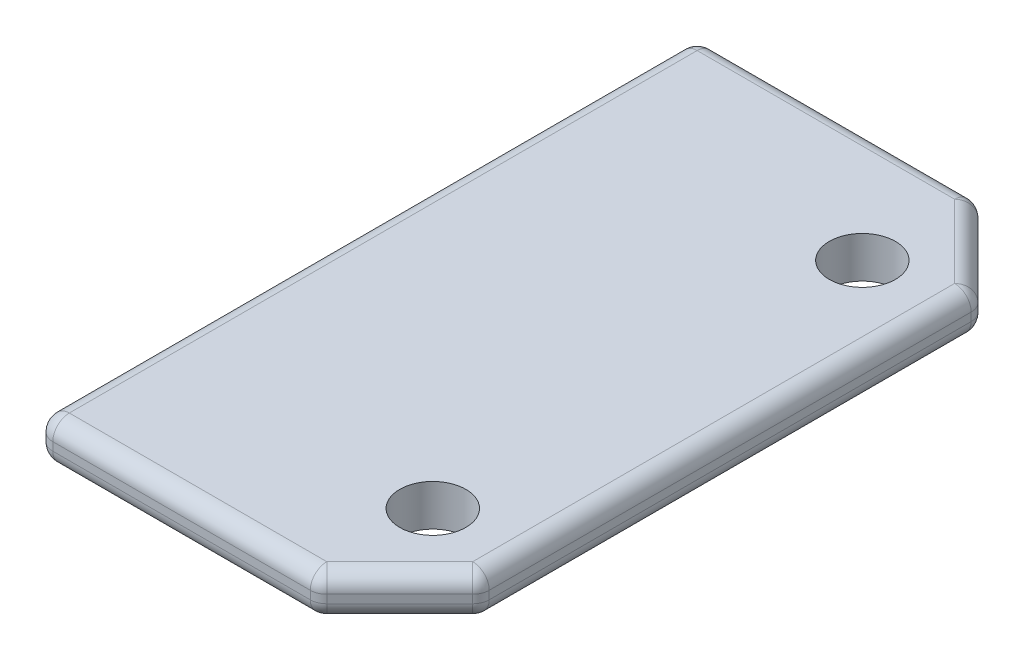
ISO-10303-21;
HEADER;
FILE_DESCRIPTION(('STEP AP214'),'2;1');
FILE_NAME('part.step','',(''),(''),'','','');
FILE_SCHEMA(('AUTOMOTIVE_DESIGN { 1 0 10303 214 1 1 1 1 }'));
ENDSEC;
DATA;
#1=APPLICATION_CONTEXT('core data for automotive mechanical design processes');
#2=APPLICATION_PROTOCOL_DEFINITION('international standard','automotive_design',2000,#1);
#3=PRODUCT_CONTEXT('',#1,'mechanical');
#4=PRODUCT('Part','Part','',(#3));
#5=PRODUCT_RELATED_PRODUCT_CATEGORY('part','',(#4));
#6=PRODUCT_DEFINITION_FORMATION('','',#4);
#7=PRODUCT_DEFINITION_CONTEXT('part definition',#1,'design');
#8=PRODUCT_DEFINITION('design','',#6,#7);
#9=PRODUCT_DEFINITION_SHAPE('','',#8);
#10=(LENGTH_UNIT() NAMED_UNIT(*) SI_UNIT(.MILLI.,.METRE.));
#11=(NAMED_UNIT(*) PLANE_ANGLE_UNIT() SI_UNIT($,.RADIAN.));
#12=(NAMED_UNIT(*) SI_UNIT($,.STERADIAN.) SOLID_ANGLE_UNIT());
#13=UNCERTAINTY_MEASURE_WITH_UNIT(LENGTH_MEASURE(1.E-05),#10,'distance_accuracy_value','');
#14=(GEOMETRIC_REPRESENTATION_CONTEXT(3) GLOBAL_UNCERTAINTY_ASSIGNED_CONTEXT((#13)) GLOBAL_UNIT_ASSIGNED_CONTEXT((#10,
#11,#12)) REPRESENTATION_CONTEXT('',''));
#15=CARTESIAN_POINT('',(0.,0.,0.));
#16=DIRECTION('',(0.,0.,1.));
#17=DIRECTION('',(1.,0.,0.));
#18=AXIS2_PLACEMENT_3D('',#15,#16,#17);
#19=CARTESIAN_POINT('',(30.5547665253783,2.5,-42.6417921448394));
#20=DIRECTION('',(0.,1.,0.));
#21=DIRECTION('',(0.,0.,1.));
#22=AXIS2_PLACEMENT_3D('',#19,#20,#21);
#23=PLANE('',#22);
#24=DIRECTION('',(1.,0.,0.));
#25=VECTOR('',#24,1.);
#26=CARTESIAN_POINT('',(46.1405529630052,2.5,-4.64179214483939));
#27=LINE('',#26,#25);
#28=CARTESIAN_POINT('',(30.5547665253783,2.5,-4.64179214483938));
#29=VERTEX_POINT('',#28);
#30=CARTESIAN_POINT('',(46.1405529630052,2.5,-4.64179214483939));
#31=VERTEX_POINT('',#30);
#32=EDGE_CURVE('E63',#29,#31,#27,.T.);
#33=ORIENTED_EDGE('',*,*,#32,.T.);
#34=DIRECTION('',(0.70710678118655,0.,-0.707106781186545));
#35=VECTOR('',#34,1.);
#36=CARTESIAN_POINT('',(50.5547665253783,2.5,-9.05600570721245));
#37=LINE('',#36,#35);
#38=CARTESIAN_POINT('',(50.5547665253783,2.5,-9.05600570721245));
#39=VERTEX_POINT('',#38);
#40=EDGE_CURVE('E183',#31,#39,#37,.T.);
#41=ORIENTED_EDGE('',*,*,#40,.T.);
#42=DIRECTION('',(0.,0.,-1.));
#43=VECTOR('',#42,1.);
#44=CARTESIAN_POINT('',(50.5547665253783,2.5,-38.2275785824663));
#45=LINE('',#44,#43);
#46=CARTESIAN_POINT('',(50.5547665253783,2.5,-38.2275785824663));
#47=VERTEX_POINT('',#46);
#48=EDGE_CURVE('E209',#39,#47,#45,.T.);
#49=ORIENTED_EDGE('',*,*,#48,.T.);
#50=DIRECTION('',(-0.707106781186544,0.,-0.707106781186551));
#51=VECTOR('',#50,1.);
#52=CARTESIAN_POINT('',(46.1405529630052,2.5,-42.6417921448394));
#53=LINE('',#52,#51);
#54=CARTESIAN_POINT('',(46.1405529630052,2.5,-42.6417921448394));
#55=VERTEX_POINT('',#54);
#56=EDGE_CURVE('E455',#47,#55,#53,.T.);
#57=ORIENTED_EDGE('',*,*,#56,.T.);
#58=DIRECTION('',(-1.,0.,0.));
#59=VECTOR('',#58,1.);
#60=CARTESIAN_POINT('',(30.5547665253783,2.5,-42.6417921448394));
#61=LINE('',#60,#59);
#62=CARTESIAN_POINT('',(30.5547665253783,2.5,-42.6417921448394));
#63=VERTEX_POINT('',#62);
#64=EDGE_CURVE('E458',#55,#63,#61,.T.);
#65=ORIENTED_EDGE('',*,*,#64,.T.);
#66=DIRECTION('',(0.,0.,1.));
#67=VECTOR('',#66,1.);
#68=CARTESIAN_POINT('',(30.5547665253783,2.5,-4.64179214483938));
#69=LINE('',#68,#67);
#70=EDGE_CURVE('E68',#63,#29,#69,.T.);
#71=ORIENTED_EDGE('',*,*,#70,.T.);
#72=EDGE_LOOP('',(#33,#41,#49,#57,#65,#71));
#73=FACE_BOUND('',#72,.T.);
#74=CARTESIAN_POINT('',(46.5547665253783,2.5,-10.6417921448394));
#75=DIRECTION('',(0.,1.,0.));
#76=DIRECTION('',(0.,0.,1.));
#77=AXIS2_PLACEMENT_3D('',#74,#75,#76);
#78=CIRCLE('',#77,2.00000000000003);
#79=CARTESIAN_POINT('',(46.5547665253783,2.5,-8.64179214483933));
#80=VERTEX_POINT('',#79);
#81=EDGE_CURVE('E326',#80,#80,#78,.T.);
#82=ORIENTED_EDGE('',*,*,#81,.F.);
#83=EDGE_LOOP('',(#82));
#84=FACE_BOUND('',#83,.T.);
#85=CARTESIAN_POINT('',(46.5547665253783,2.5,-36.6417921448394));
#86=DIRECTION('',(0.,1.,0.));
#87=DIRECTION('',(0.,0.,1.));
#88=AXIS2_PLACEMENT_3D('',#85,#86,#87);
#89=CIRCLE('',#88,2.00000000000003);
#90=CARTESIAN_POINT('',(46.5547665253783,2.5,-34.6417921448393));
#91=VERTEX_POINT('',#90);
#92=EDGE_CURVE('E317',#91,#91,#89,.T.);
#93=ORIENTED_EDGE('',*,*,#92,.F.);
#94=EDGE_LOOP('',(#93));
#95=FACE_BOUND('',#94,.T.);
#96=ADVANCED_FACE('F45',(#73,#84,#95),#23,.T.);
#97=CARTESIAN_POINT('',(30.5547665253783,0.,-42.6417921448394));
#98=DIRECTION('',(0.,1.,0.));
#99=DIRECTION('',(0.,0.,1.));
#100=AXIS2_PLACEMENT_3D('',#97,#98,#99);
#101=PLANE('',#100);
#102=DIRECTION('',(0.,0.,-1.));
#103=VECTOR('',#102,1.);
#104=CARTESIAN_POINT('',(50.5547665253783,0.,-42.6417921448394));
#105=LINE('',#104,#103);
#106=CARTESIAN_POINT('',(50.5547665253783,0.,-38.2275785824663));
#107=VERTEX_POINT('',#106);
#108=CARTESIAN_POINT('',(50.5547665253783,0.,-9.05600570721245));
#109=VERTEX_POINT('',#108);
#110=EDGE_CURVE('E380',#107,#109,#105,.F.);
#111=ORIENTED_EDGE('',*,*,#110,.T.);
#112=DIRECTION('',(0.70710678118655,0.,-0.707106781186545));
#113=VECTOR('',#112,1.);
#114=CARTESIAN_POINT('',(57.3476597441916,0.,-15.8488989260258));
#115=LINE('',#114,#113);
#116=CARTESIAN_POINT('',(46.1405529630052,0.,-4.64179214483939));
#117=VERTEX_POINT('',#116);
#118=EDGE_CURVE('E395',#109,#117,#115,.F.);
#119=ORIENTED_EDGE('',*,*,#118,.T.);
#120=DIRECTION('',(1.,0.,0.));
#121=VECTOR('',#120,1.);
#122=CARTESIAN_POINT('',(30.5547665253783,0.,-4.64179214483939));
#123=LINE('',#122,#121);
#124=CARTESIAN_POINT('',(30.5547665253783,0.,-4.64179214483938));
#125=VERTEX_POINT('',#124);
#126=EDGE_CURVE('E392',#117,#125,#123,.F.);
#127=ORIENTED_EDGE('',*,*,#126,.T.);
#128=DIRECTION('',(0.,0.,1.));
#129=VECTOR('',#128,1.);
#130=CARTESIAN_POINT('',(30.5547665253783,0.,-42.6417921448394));
#131=LINE('',#130,#129);
#132=CARTESIAN_POINT('',(30.5547665253783,0.,-42.6417921448394));
#133=VERTEX_POINT('',#132);
#134=EDGE_CURVE('E389',#125,#133,#131,.F.);
#135=ORIENTED_EDGE('',*,*,#134,.T.);
#136=DIRECTION('',(-1.,0.,0.));
#137=VECTOR('',#136,1.);
#138=CARTESIAN_POINT('',(30.5547665253783,0.,-42.6417921448394));
#139=LINE('',#138,#137);
#140=CARTESIAN_POINT('',(46.1405529630052,0.,-42.6417921448394));
#141=VERTEX_POINT('',#140);
#142=EDGE_CURVE('E386',#133,#141,#139,.F.);
#143=ORIENTED_EDGE('',*,*,#142,.T.);
#144=DIRECTION('',(-0.707106781186544,0.,-0.707106781186551));
#145=VECTOR('',#144,1.);
#146=CARTESIAN_POINT('',(38.3476597441918,0.,-50.4346853636529));
#147=LINE('',#146,#145);
#148=EDGE_CURVE('E383',#141,#107,#147,.F.);
#149=ORIENTED_EDGE('',*,*,#148,.T.);
#150=EDGE_LOOP('',(#111,#119,#127,#135,#143,#149));
#151=FACE_BOUND('',#150,.T.);
#152=CARTESIAN_POINT('',(46.5547665253783,0.,-10.6417921448394));
#153=DIRECTION('',(0.,1.,0.));
#154=DIRECTION('',(0.,0.,1.));
#155=AXIS2_PLACEMENT_3D('',#152,#153,#154);
#156=CIRCLE('',#155,2.00000000000003);
#157=CARTESIAN_POINT('',(46.5547665253783,0.,-8.64179214483933));
#158=VERTEX_POINT('',#157);
#159=EDGE_CURVE('E323',#158,#158,#156,.T.);
#160=ORIENTED_EDGE('',*,*,#159,.T.);
#161=EDGE_LOOP('',(#160));
#162=FACE_BOUND('',#161,.T.);
#163=CARTESIAN_POINT('',(46.5547665253783,0.,-36.6417921448394));
#164=DIRECTION('',(0.,1.,0.));
#165=DIRECTION('',(0.,0.,1.));
#166=AXIS2_PLACEMENT_3D('',#163,#164,#165);
#167=CIRCLE('',#166,2.00000000000003);
#168=CARTESIAN_POINT('',(46.5547665253783,0.,-34.6417921448393));
#169=VERTEX_POINT('',#168);
#170=EDGE_CURVE('E310',#169,#169,#167,.T.);
#171=ORIENTED_EDGE('',*,*,#170,.T.);
#172=EDGE_LOOP('',(#171));
#173=FACE_BOUND('',#172,.T.);
#174=ADVANCED_FACE('F529',(#151,#162,#173),#101,.F.);
#175=CARTESIAN_POINT('',(29.5547665253783,2.5,-4.64179214483938));
#176=DIRECTION('',(1.,0.,0.));
#177=DIRECTION('',(0.,0.,-1.));
#178=AXIS2_PLACEMENT_3D('',#175,#176,#177);
#179=PLANE('',#178);
#180=DIRECTION('',(0.,-1.,0.));
#181=VECTOR('',#180,1.);
#182=CARTESIAN_POINT('',(29.5547665253783,2.5,-42.6417921448394));
#183=LINE('',#182,#181);
#184=CARTESIAN_POINT('',(29.5547665253783,1.5,-42.6417921448394));
#185=VERTEX_POINT('',#184);
#186=CARTESIAN_POINT('',(29.5547665253783,1.,-42.6417921448394));
#187=VERTEX_POINT('',#186);
#188=EDGE_CURVE('E330',#185,#187,#183,.T.);
#189=ORIENTED_EDGE('',*,*,#188,.T.);
#190=DIRECTION('',(0.,0.,1.));
#191=VECTOR('',#190,1.);
#192=CARTESIAN_POINT('',(29.5547665253783,1.,-4.64179214483938));
#193=LINE('',#192,#191);
#194=CARTESIAN_POINT('',(29.5547665253783,1.,-4.64179214483938));
#195=VERTEX_POINT('',#194);
#196=EDGE_CURVE('E420',#187,#195,#193,.T.);
#197=ORIENTED_EDGE('',*,*,#196,.T.);
#198=DIRECTION('',(0.,-1.,0.));
#199=VECTOR('',#198,1.);
#200=CARTESIAN_POINT('',(29.5547665253783,2.5,-4.64179214483938));
#201=LINE('',#200,#199);
#202=CARTESIAN_POINT('',(29.5547665253783,1.5,-4.64179214483938));
#203=VERTEX_POINT('',#202);
#204=EDGE_CURVE('E205',#203,#195,#201,.T.);
#205=ORIENTED_EDGE('',*,*,#204,.F.);
#206=DIRECTION('',(0.,0.,1.));
#207=VECTOR('',#206,1.);
#208=CARTESIAN_POINT('',(29.5547665253783,1.5,-42.6417921448394));
#209=LINE('',#208,#207);
#210=EDGE_CURVE('E417',#203,#185,#209,.F.);
#211=ORIENTED_EDGE('',*,*,#210,.T.);
#212=EDGE_LOOP('',(#189,#197,#205,#211));
#213=FACE_BOUND('',#212,.T.);
#214=ADVANCED_FACE('F501',(#213),#179,.F.);
#215=CARTESIAN_POINT('',(30.5547665253783,2.5,-4.64179214483938));
#216=DIRECTION('',(0.,-1.,0.));
#217=DIRECTION('',(0.,0.,-1.));
#218=AXIS2_PLACEMENT_3D('',#215,#216,#217);
#219=CYLINDRICAL_SURFACE('',#218,0.999999999999997);
#220=ORIENTED_EDGE('',*,*,#204,.T.);
#221=CARTESIAN_POINT('',(30.5547665253783,1.,-4.64179214483938));
#222=DIRECTION('',(0.,-1.,0.));
#223=DIRECTION('',(0.,0.,-1.));
#224=AXIS2_PLACEMENT_3D('',#221,#222,#223);
#225=CIRCLE('',#224,0.999999999999997);
#226=CARTESIAN_POINT('',(30.5547665253783,1.,-3.64179214483939));
#227=VERTEX_POINT('',#226);
#228=EDGE_CURVE('E414',#195,#227,#225,.F.);
#229=ORIENTED_EDGE('',*,*,#228,.T.);
#230=DIRECTION('',(0.,-1.,0.));
#231=VECTOR('',#230,1.);
#232=CARTESIAN_POINT('',(30.5547665253783,2.5,-3.64179214483939));
#233=LINE('',#232,#231);
#234=CARTESIAN_POINT('',(30.5547665253783,1.5,-3.64179214483939));
#235=VERTEX_POINT('',#234);
#236=EDGE_CURVE('E365',#235,#227,#233,.T.);
#237=ORIENTED_EDGE('',*,*,#236,.F.);
#238=CARTESIAN_POINT('',(30.5547665253783,1.5,-4.64179214483938));
#239=DIRECTION('',(0.,-1.,0.));
#240=DIRECTION('',(0.,0.,-1.));
#241=AXIS2_PLACEMENT_3D('',#238,#239,#240);
#242=CIRCLE('',#241,0.999999999999997);
#243=EDGE_CURVE('E411',#235,#203,#242,.T.);
#244=ORIENTED_EDGE('',*,*,#243,.T.);
#245=EDGE_LOOP('',(#220,#229,#237,#244));
#246=FACE_BOUND('',#245,.T.);
#247=ADVANCED_FACE('F493',(#246),#219,.T.);
#248=CARTESIAN_POINT('',(46.1405529630052,2.5,-3.64179214483939));
#249=DIRECTION('',(0.,0.,-1.));
#250=DIRECTION('',(-1.,0.,0.));
#251=AXIS2_PLACEMENT_3D('',#248,#249,#250);
#252=PLANE('',#251);
#253=ORIENTED_EDGE('',*,*,#236,.T.);
#254=DIRECTION('',(1.,0.,0.));
#255=VECTOR('',#254,1.);
#256=CARTESIAN_POINT('',(46.1405529630052,1.,-3.64179214483939));
#257=LINE('',#256,#255);
#258=CARTESIAN_POINT('',(46.1405529630052,1.,-3.64179214483939));
#259=VERTEX_POINT('',#258);
#260=EDGE_CURVE('E408',#227,#259,#257,.T.);
#261=ORIENTED_EDGE('',*,*,#260,.T.);
#262=DIRECTION('',(0.,-1.,0.));
#263=VECTOR('',#262,1.);
#264=CARTESIAN_POINT('',(46.1405529630052,2.5,-3.64179214483939));
#265=LINE('',#264,#263);
#266=CARTESIAN_POINT('',(46.1405529630052,1.5,-3.64179214483939));
#267=VERTEX_POINT('',#266);
#268=EDGE_CURVE('E361',#267,#259,#265,.T.);
#269=ORIENTED_EDGE('',*,*,#268,.F.);
#270=DIRECTION('',(1.,0.,0.));
#271=VECTOR('',#270,1.);
#272=CARTESIAN_POINT('',(30.5547665253783,1.5,-3.64179214483939));
#273=LINE('',#272,#271);
#274=EDGE_CURVE('E405',#267,#235,#273,.F.);
#275=ORIENTED_EDGE('',*,*,#274,.T.);
#276=EDGE_LOOP('',(#253,#261,#269,#275));
#277=FACE_BOUND('',#276,.T.);
#278=ADVANCED_FACE('F489',(#277),#252,.F.);
#279=CARTESIAN_POINT('',(46.1405529630052,2.5,-4.64179214483938));
#280=DIRECTION('',(0.,-1.,0.));
#281=DIRECTION('',(0.,0.,-1.));
#282=AXIS2_PLACEMENT_3D('',#279,#280,#281);
#283=CYLINDRICAL_SURFACE('',#282,0.999999999999995);
#284=ORIENTED_EDGE('',*,*,#268,.T.);
#285=CARTESIAN_POINT('',(46.1405529630052,1.,-4.64179214483938));
#286=DIRECTION('',(0.,-1.,0.));
#287=DIRECTION('',(0.,0.,-1.));
#288=AXIS2_PLACEMENT_3D('',#285,#286,#287);
#289=CIRCLE('',#288,0.999999999999995);
#290=CARTESIAN_POINT('',(46.8476597441917,1.,-3.93468536365284));
#291=VERTEX_POINT('',#290);
#292=EDGE_CURVE('E402',#259,#291,#289,.F.);
#293=ORIENTED_EDGE('',*,*,#292,.T.);
#294=DIRECTION('',(0.,-1.,0.));
#295=VECTOR('',#294,1.);
#296=CARTESIAN_POINT('',(46.8476597441917,2.5,-3.93468536365284));
#297=LINE('',#296,#295);
#298=CARTESIAN_POINT('',(46.8476597441917,1.5,-3.93468536365284));
#299=VERTEX_POINT('',#298);
#300=EDGE_CURVE('E357',#299,#291,#297,.T.);
#301=ORIENTED_EDGE('',*,*,#300,.F.);
#302=CARTESIAN_POINT('',(46.1405529630052,1.5,-4.64179214483938));
#303=DIRECTION('',(0.,-1.,0.));
#304=DIRECTION('',(0.,0.,-1.));
#305=AXIS2_PLACEMENT_3D('',#302,#303,#304);
#306=CIRCLE('',#305,0.999999999999995);
#307=EDGE_CURVE('E399',#299,#267,#306,.T.);
#308=ORIENTED_EDGE('',*,*,#307,.T.);
#309=EDGE_LOOP('',(#284,#293,#301,#308));
#310=FACE_BOUND('',#309,.T.);
#311=ADVANCED_FACE('F478',(#310),#283,.T.);
#312=CARTESIAN_POINT('',(51.2618733065648,2.5,-8.3488989260259));
#313=DIRECTION('',(-0.707106781186545,0.,-0.70710678118655));
#314=DIRECTION('',(-0.70710678118655,0.,0.707106781186545));
#315=AXIS2_PLACEMENT_3D('',#312,#313,#314);
#316=PLANE('',#315);
#317=ORIENTED_EDGE('',*,*,#300,.T.);
#318=DIRECTION('',(0.70710678118655,0.,-0.707106781186545));
#319=VECTOR('',#318,1.);
#320=CARTESIAN_POINT('',(51.2618733065648,1.,-8.3488989260259));
#321=LINE('',#320,#319);
#322=CARTESIAN_POINT('',(51.2618733065648,1.,-8.3488989260259));
#323=VERTEX_POINT('',#322);
#324=EDGE_CURVE('E377',#291,#323,#321,.T.);
#325=ORIENTED_EDGE('',*,*,#324,.T.);
#326=DIRECTION('',(0.,-1.,0.));
#327=VECTOR('',#326,1.);
#328=CARTESIAN_POINT('',(51.2618733065648,2.5,-8.3488989260259));
#329=LINE('',#328,#327);
#330=CARTESIAN_POINT('',(51.2618733065648,1.5,-8.3488989260259));
#331=VERTEX_POINT('',#330);
#332=EDGE_CURVE('E196',#331,#323,#329,.T.);
#333=ORIENTED_EDGE('',*,*,#332,.F.);
#334=DIRECTION('',(0.70710678118655,0.,-0.707106781186545));
#335=VECTOR('',#334,1.);
#336=CARTESIAN_POINT('',(46.8476597441917,1.5,-3.93468536365284));
#337=LINE('',#336,#335);
#338=EDGE_CURVE('E374',#331,#299,#337,.F.);
#339=ORIENTED_EDGE('',*,*,#338,.T.);
#340=EDGE_LOOP('',(#317,#325,#333,#339));
#341=FACE_BOUND('',#340,.T.);
#342=ADVANCED_FACE('F474',(#341),#316,.F.);
#343=CARTESIAN_POINT('',(50.5547665253783,2.5,-9.05600570721245));
#344=DIRECTION('',(0.,-1.,0.));
#345=DIRECTION('',(0.,0.,-1.));
#346=AXIS2_PLACEMENT_3D('',#343,#344,#345);
#347=CYLINDRICAL_SURFACE('',#346,0.999999999999999);
#348=ORIENTED_EDGE('',*,*,#332,.T.);
#349=CARTESIAN_POINT('',(50.5547665253783,1.,-9.05600570721245));
#350=DIRECTION('',(0.,-1.,0.));
#351=DIRECTION('',(0.,0.,-1.));
#352=AXIS2_PLACEMENT_3D('',#349,#350,#351);
#353=CIRCLE('',#352,0.999999999999999);
#354=CARTESIAN_POINT('',(51.5547665253783,1.,-9.05600570721245));
#355=VERTEX_POINT('',#354);
#356=EDGE_CURVE('E194',#323,#355,#353,.F.);
#357=ORIENTED_EDGE('',*,*,#356,.T.);
#358=DIRECTION('',(0.,-1.,0.));
#359=VECTOR('',#358,1.);
#360=CARTESIAN_POINT('',(51.5547665253783,2.5,-9.05600570721245));
#361=LINE('',#360,#359);
#362=CARTESIAN_POINT('',(51.5547665253783,1.5,-9.05600570721245));
#363=VERTEX_POINT('',#362);
#364=EDGE_CURVE('E175',#363,#355,#361,.T.);
#365=ORIENTED_EDGE('',*,*,#364,.F.);
#366=CARTESIAN_POINT('',(50.5547665253783,1.5,-9.05600570721245));
#367=DIRECTION('',(0.,-1.,0.));
#368=DIRECTION('',(0.,0.,-1.));
#369=AXIS2_PLACEMENT_3D('',#366,#367,#368);
#370=CIRCLE('',#369,0.999999999999999);
#371=EDGE_CURVE('E191',#363,#331,#370,.T.);
#372=ORIENTED_EDGE('',*,*,#371,.T.);
#373=EDGE_LOOP('',(#348,#357,#365,#372));
#374=FACE_BOUND('',#373,.T.);
#375=ADVANCED_FACE('F190',(#374),#347,.T.);
#376=CARTESIAN_POINT('',(51.5547665253783,2.5,-38.2275785824663));
#377=DIRECTION('',(-1.,0.,0.));
#378=DIRECTION('',(0.,0.,1.));
#379=AXIS2_PLACEMENT_3D('',#376,#377,#378);
#380=PLANE('',#379);
#381=ORIENTED_EDGE('',*,*,#364,.T.);
#382=DIRECTION('',(0.,0.,-1.));
#383=VECTOR('',#382,1.);
#384=CARTESIAN_POINT('',(51.5547665253783,1.,-38.2275785824663));
#385=LINE('',#384,#383);
#386=CARTESIAN_POINT('',(51.5547665253783,1.,-38.2275785824663));
#387=VERTEX_POINT('',#386);
#388=EDGE_CURVE('E11',#355,#387,#385,.T.);
#389=ORIENTED_EDGE('',*,*,#388,.T.);
#390=DIRECTION('',(0.,-1.,0.));
#391=VECTOR('',#390,1.);
#392=CARTESIAN_POINT('',(51.5547665253783,2.5,-38.2275785824663));
#393=LINE('',#392,#391);
#394=CARTESIAN_POINT('',(51.5547665253783,1.5,-38.2275785824663));
#395=VERTEX_POINT('',#394);
#396=EDGE_CURVE('E177',#395,#387,#393,.T.);
#397=ORIENTED_EDGE('',*,*,#396,.F.);
#398=DIRECTION('',(0.,0.,-1.));
#399=VECTOR('',#398,1.);
#400=CARTESIAN_POINT('',(51.5547665253783,1.5,-9.05600570721245));
#401=LINE('',#400,#399);
#402=EDGE_CURVE('E55',#395,#363,#401,.F.);
#403=ORIENTED_EDGE('',*,*,#402,.T.);
#404=EDGE_LOOP('',(#381,#389,#397,#403));
#405=FACE_BOUND('',#404,.T.);
#406=ADVANCED_FACE('F174',(#405),#380,.F.);
#407=CARTESIAN_POINT('',(50.5547665253783,2.5,-38.2275785824663));
#408=DIRECTION('',(0.,-1.,0.));
#409=DIRECTION('',(0.,0.,-1.));
#410=AXIS2_PLACEMENT_3D('',#407,#408,#409);
#411=CYLINDRICAL_SURFACE('',#410,0.999999999999999);
#412=ORIENTED_EDGE('',*,*,#396,.T.);
#413=CARTESIAN_POINT('',(50.5547665253783,1.,-38.2275785824663));
#414=DIRECTION('',(0.,-1.,0.));
#415=DIRECTION('',(0.,0.,-1.));
#416=AXIS2_PLACEMENT_3D('',#413,#414,#415);
#417=CIRCLE('',#416,0.999999999999999);
#418=CARTESIAN_POINT('',(51.2618733065648,1.,-38.9346853636528));
#419=VERTEX_POINT('',#418);
#420=EDGE_CURVE('E450',#387,#419,#417,.F.);
#421=ORIENTED_EDGE('',*,*,#420,.T.);
#422=DIRECTION('',(0.,-1.,0.));
#423=VECTOR('',#422,1.);
#424=CARTESIAN_POINT('',(51.2618733065648,2.5,-38.9346853636528));
#425=LINE('',#424,#423);
#426=CARTESIAN_POINT('',(51.2618733065648,1.5,-38.9346853636528));
#427=VERTEX_POINT('',#426);
#428=EDGE_CURVE('E349',#427,#419,#425,.T.);
#429=ORIENTED_EDGE('',*,*,#428,.F.);
#430=CARTESIAN_POINT('',(50.5547665253783,1.5,-38.2275785824663));
#431=DIRECTION('',(0.,-1.,0.));
#432=DIRECTION('',(0.,0.,-1.));
#433=AXIS2_PLACEMENT_3D('',#430,#431,#432);
#434=CIRCLE('',#433,0.999999999999999);
#435=EDGE_CURVE('E447',#427,#395,#434,.T.);
#436=ORIENTED_EDGE('',*,*,#435,.T.);
#437=EDGE_LOOP('',(#412,#421,#429,#436));
#438=FACE_BOUND('',#437,.T.);
#439=ADVANCED_FACE('F582',(#438),#411,.T.);
#440=CARTESIAN_POINT('',(46.8476597441918,2.5,-43.3488989260259));
#441=DIRECTION('',(-0.707106781186551,0.,0.707106781186544));
#442=DIRECTION('',(0.707106781186544,0.,0.707106781186551));
#443=AXIS2_PLACEMENT_3D('',#440,#441,#442);
#444=PLANE('',#443);
#445=ORIENTED_EDGE('',*,*,#428,.T.);
#446=DIRECTION('',(-0.707106781186544,0.,-0.707106781186551));
#447=VECTOR('',#446,1.);
#448=CARTESIAN_POINT('',(46.8476597441918,1.,-43.3488989260259));
#449=LINE('',#448,#447);
#450=CARTESIAN_POINT('',(46.8476597441918,1.,-43.3488989260259));
#451=VERTEX_POINT('',#450);
#452=EDGE_CURVE('E444',#419,#451,#449,.T.);
#453=ORIENTED_EDGE('',*,*,#452,.T.);
#454=DIRECTION('',(0.,-1.,0.));
#455=VECTOR('',#454,1.);
#456=CARTESIAN_POINT('',(46.8476597441918,2.5,-43.3488989260259));
#457=LINE('',#456,#455);
#458=CARTESIAN_POINT('',(46.8476597441918,1.5,-43.3488989260259));
#459=VERTEX_POINT('',#458);
#460=EDGE_CURVE('E345',#459,#451,#457,.T.);
#461=ORIENTED_EDGE('',*,*,#460,.F.);
#462=DIRECTION('',(-0.707106781186544,0.,-0.707106781186551));
#463=VECTOR('',#462,1.);
#464=CARTESIAN_POINT('',(51.2618733065648,1.5,-38.9346853636528));
#465=LINE('',#464,#463);
#466=EDGE_CURVE('E441',#459,#427,#465,.F.);
#467=ORIENTED_EDGE('',*,*,#466,.T.);
#468=EDGE_LOOP('',(#445,#453,#461,#467));
#469=FACE_BOUND('',#468,.T.);
#470=ADVANCED_FACE('F579',(#469),#444,.F.);
#471=CARTESIAN_POINT('',(46.1405529630052,2.5,-42.6417921448394));
#472=DIRECTION('',(0.,-1.,0.));
#473=DIRECTION('',(0.,0.,-1.));
#474=AXIS2_PLACEMENT_3D('',#471,#472,#473);
#475=CYLINDRICAL_SURFACE('',#474,0.999999999999999);
#476=ORIENTED_EDGE('',*,*,#460,.T.);
#477=CARTESIAN_POINT('',(46.1405529630052,1.,-42.6417921448394));
#478=DIRECTION('',(0.,-1.,0.));
#479=DIRECTION('',(0.,0.,-1.));
#480=AXIS2_PLACEMENT_3D('',#477,#478,#479);
#481=CIRCLE('',#480,0.999999999999999);
#482=CARTESIAN_POINT('',(46.1405529630052,1.,-43.6417921448394));
#483=VERTEX_POINT('',#482);
#484=EDGE_CURVE('E438',#451,#483,#481,.F.);
#485=ORIENTED_EDGE('',*,*,#484,.T.);
#486=DIRECTION('',(0.,-1.,0.));
#487=VECTOR('',#486,1.);
#488=CARTESIAN_POINT('',(46.1405529630052,2.5,-43.6417921448394));
#489=LINE('',#488,#487);
#490=CARTESIAN_POINT('',(46.1405529630052,1.5,-43.6417921448394));
#491=VERTEX_POINT('',#490);
#492=EDGE_CURVE('E341',#491,#483,#489,.T.);
#493=ORIENTED_EDGE('',*,*,#492,.F.);
#494=CARTESIAN_POINT('',(46.1405529630052,1.5,-42.6417921448394));
#495=DIRECTION('',(0.,-1.,0.));
#496=DIRECTION('',(0.,0.,-1.));
#497=AXIS2_PLACEMENT_3D('',#494,#495,#496);
#498=CIRCLE('',#497,0.999999999999999);
#499=EDGE_CURVE('E435',#491,#459,#498,.T.);
#500=ORIENTED_EDGE('',*,*,#499,.T.);
#501=EDGE_LOOP('',(#476,#485,#493,#500));
#502=FACE_BOUND('',#501,.T.);
#503=ADVANCED_FACE('F515',(#502),#475,.T.);
#504=CARTESIAN_POINT('',(30.5547665253783,2.5,-43.6417921448394));
#505=DIRECTION('',(0.,0.,1.));
#506=DIRECTION('',(1.,0.,0.));
#507=AXIS2_PLACEMENT_3D('',#504,#505,#506);
#508=PLANE('',#507);
#509=ORIENTED_EDGE('',*,*,#492,.T.);
#510=DIRECTION('',(-1.,0.,0.));
#511=VECTOR('',#510,1.);
#512=CARTESIAN_POINT('',(30.5547665253783,1.,-43.6417921448394));
#513=LINE('',#512,#511);
#514=CARTESIAN_POINT('',(30.5547665253783,1.,-43.6417921448394));
#515=VERTEX_POINT('',#514);
#516=EDGE_CURVE('E432',#483,#515,#513,.T.);
#517=ORIENTED_EDGE('',*,*,#516,.T.);
#518=DIRECTION('',(0.,-1.,0.));
#519=VECTOR('',#518,1.);
#520=CARTESIAN_POINT('',(30.5547665253783,2.5,-43.6417921448394));
#521=LINE('',#520,#519);
#522=CARTESIAN_POINT('',(30.5547665253783,1.5,-43.6417921448394));
#523=VERTEX_POINT('',#522);
#524=EDGE_CURVE('E337',#523,#515,#521,.T.);
#525=ORIENTED_EDGE('',*,*,#524,.F.);
#526=DIRECTION('',(-1.,0.,0.));
#527=VECTOR('',#526,1.);
#528=CARTESIAN_POINT('',(46.1405529630052,1.5,-43.6417921448394));
#529=LINE('',#528,#527);
#530=EDGE_CURVE('E429',#523,#491,#529,.F.);
#531=ORIENTED_EDGE('',*,*,#530,.T.);
#532=EDGE_LOOP('',(#509,#517,#525,#531));
#533=FACE_BOUND('',#532,.T.);
#534=ADVANCED_FACE('F513',(#533),#508,.F.);
#535=CARTESIAN_POINT('',(30.5547665253783,2.5,-42.6417921448394));
#536=DIRECTION('',(0.,-1.,0.));
#537=DIRECTION('',(0.,0.,-1.));
#538=AXIS2_PLACEMENT_3D('',#535,#536,#537);
#539=CYLINDRICAL_SURFACE('',#538,1.);
#540=ORIENTED_EDGE('',*,*,#524,.T.);
#541=CARTESIAN_POINT('',(30.5547665253783,1.,-42.6417921448394));
#542=DIRECTION('',(0.,-1.,0.));
#543=DIRECTION('',(0.,0.,-1.));
#544=AXIS2_PLACEMENT_3D('',#541,#542,#543);
#545=CIRCLE('',#544,1.);
#546=EDGE_CURVE('E426',#515,#187,#545,.F.);
#547=ORIENTED_EDGE('',*,*,#546,.T.);
#548=ORIENTED_EDGE('',*,*,#188,.F.);
#549=CARTESIAN_POINT('',(30.5547665253783,1.5,-42.6417921448394));
#550=DIRECTION('',(0.,-1.,0.));
#551=DIRECTION('',(0.,0.,-1.));
#552=AXIS2_PLACEMENT_3D('',#549,#550,#551);
#553=CIRCLE('',#552,1.);
#554=EDGE_CURVE('E423',#185,#523,#553,.T.);
#555=ORIENTED_EDGE('',*,*,#554,.T.);
#556=EDGE_LOOP('',(#540,#547,#548,#555));
#557=FACE_BOUND('',#556,.T.);
#558=ADVANCED_FACE('F504',(#557),#539,.T.);
#559=CARTESIAN_POINT('',(46.5547665253783,2.5,-10.6417921448394));
#560=DIRECTION('',(0.,-1.,0.));
#561=DIRECTION('',(0.,0.,-1.));
#562=AXIS2_PLACEMENT_3D('',#559,#560,#561);
#563=CYLINDRICAL_SURFACE('',#562,2.00000000000003);
#564=ORIENTED_EDGE('',*,*,#81,.T.);
#565=EDGE_LOOP('',(#564));
#566=FACE_BOUND('',#565,.T.);
#567=ORIENTED_EDGE('',*,*,#159,.F.);
#568=EDGE_LOOP('',(#567));
#569=FACE_BOUND('',#568,.T.);
#570=ADVANCED_FACE('F570',(#566,#569),#563,.F.);
#571=CARTESIAN_POINT('',(46.5547665253783,2.5,-36.6417921448394));
#572=DIRECTION('',(0.,-1.,0.));
#573=DIRECTION('',(0.,0.,-1.));
#574=AXIS2_PLACEMENT_3D('',#571,#572,#573);
#575=CYLINDRICAL_SURFACE('',#574,2.00000000000003);
#576=ORIENTED_EDGE('',*,*,#92,.T.);
#577=EDGE_LOOP('',(#576));
#578=FACE_BOUND('',#577,.T.);
#579=ORIENTED_EDGE('',*,*,#170,.F.);
#580=EDGE_LOOP('',(#579));
#581=FACE_BOUND('',#580,.T.);
#582=ADVANCED_FACE('F667',(#578,#581),#575,.F.);
#583=CARTESIAN_POINT('',(30.5547665253783,1.,-42.6417921448394));
#584=DIRECTION('',(0.,1.,0.));
#585=DIRECTION('',(0.,0.,1.));
#586=AXIS2_PLACEMENT_3D('',#583,#584,#585);
#587=SPHERICAL_SURFACE('',#586,1.);
#588=CARTESIAN_POINT('',(30.5547665253783,1.,-42.6417921448394));
#589=DIRECTION('',(1.,0.,0.));
#590=DIRECTION('',(0.,0.,-1.));
#591=AXIS2_PLACEMENT_3D('',#588,#589,#590);
#592=CIRCLE('',#591,1.);
#593=EDGE_CURVE('E301',#133,#515,#592,.T.);
#594=ORIENTED_EDGE('',*,*,#593,.F.);
#595=CARTESIAN_POINT('',(30.5547665253783,1.,-42.6417921448394));
#596=DIRECTION('',(0.,0.,1.));
#597=DIRECTION('',(1.,0.,0.));
#598=AXIS2_PLACEMENT_3D('',#595,#596,#597);
#599=CIRCLE('',#598,1.);
#600=EDGE_CURVE('E216',#187,#133,#599,.T.);
#601=ORIENTED_EDGE('',*,*,#600,.F.);
#602=ORIENTED_EDGE('',*,*,#546,.F.);
#603=EDGE_LOOP('',(#594,#601,#602));
#604=FACE_BOUND('',#603,.T.);
#605=ADVANCED_FACE('F535',(#604),#587,.T.);
#606=CARTESIAN_POINT('',(30.5547665253783,1.,-4.64179214483938));
#607=DIRECTION('',(0.,0.,1.));
#608=DIRECTION('',(1.,0.,0.));
#609=AXIS2_PLACEMENT_3D('',#606,#607,#608);
#610=CYLINDRICAL_SURFACE('',#609,1.);
#611=ORIENTED_EDGE('',*,*,#600,.T.);
#612=ORIENTED_EDGE('',*,*,#134,.F.);
#613=CARTESIAN_POINT('',(30.5547665253783,1.,-4.64179214483938));
#614=DIRECTION('',(0.,0.,1.));
#615=DIRECTION('',(1.,0.,0.));
#616=AXIS2_PLACEMENT_3D('',#613,#614,#615);
#617=CIRCLE('',#616,1.);
#618=EDGE_CURVE('E298',#195,#125,#617,.T.);
#619=ORIENTED_EDGE('',*,*,#618,.F.);
#620=ORIENTED_EDGE('',*,*,#196,.F.);
#621=EDGE_LOOP('',(#611,#612,#619,#620));
#622=FACE_BOUND('',#621,.T.);
#623=ADVANCED_FACE('F537',(#622),#610,.T.);
#624=CARTESIAN_POINT('',(30.5547665253783,1.,-42.6417921448394));
#625=DIRECTION('',(-1.,0.,0.));
#626=DIRECTION('',(0.,0.,1.));
#627=AXIS2_PLACEMENT_3D('',#624,#625,#626);
#628=CYLINDRICAL_SURFACE('',#627,1.);
#629=ORIENTED_EDGE('',*,*,#593,.T.);
#630=ORIENTED_EDGE('',*,*,#516,.F.);
#631=CARTESIAN_POINT('',(46.1405529630052,1.,-42.6417921448394));
#632=DIRECTION('',(1.,0.,0.));
#633=DIRECTION('',(0.,0.,-1.));
#634=AXIS2_PLACEMENT_3D('',#631,#632,#633);
#635=CIRCLE('',#634,1.);
#636=EDGE_CURVE('E294',#141,#483,#635,.T.);
#637=ORIENTED_EDGE('',*,*,#636,.F.);
#638=ORIENTED_EDGE('',*,*,#142,.F.);
#639=EDGE_LOOP('',(#629,#630,#637,#638));
#640=FACE_BOUND('',#639,.T.);
#641=ADVANCED_FACE('F533',(#640),#628,.T.);
#642=CARTESIAN_POINT('',(30.5547665253783,1.,-4.64179214483938));
#643=DIRECTION('',(0.,1.,0.));
#644=DIRECTION('',(0.,0.,1.));
#645=AXIS2_PLACEMENT_3D('',#642,#643,#644);
#646=SPHERICAL_SURFACE('',#645,1.);
#647=ORIENTED_EDGE('',*,*,#228,.F.);
#648=ORIENTED_EDGE('',*,*,#618,.T.);
#649=CARTESIAN_POINT('',(30.5547665253783,1.,-4.64179214483938));
#650=DIRECTION('',(1.,0.,0.));
#651=DIRECTION('',(0.,0.,-1.));
#652=AXIS2_PLACEMENT_3D('',#649,#650,#651);
#653=CIRCLE('',#652,1.);
#654=EDGE_CURVE('E290',#227,#125,#653,.T.);
#655=ORIENTED_EDGE('',*,*,#654,.F.);
#656=EDGE_LOOP('',(#647,#648,#655));
#657=FACE_BOUND('',#656,.T.);
#658=ADVANCED_FACE('F539',(#657),#646,.T.);
#659=CARTESIAN_POINT('',(46.1405529630052,1.,-42.6417921448394));
#660=DIRECTION('',(0.,1.,0.));
#661=DIRECTION('',(0.,0.,1.));
#662=AXIS2_PLACEMENT_3D('',#659,#660,#661);
#663=SPHERICAL_SURFACE('',#662,1.);
#664=ORIENTED_EDGE('',*,*,#636,.T.);
#665=ORIENTED_EDGE('',*,*,#484,.F.);
#666=CARTESIAN_POINT('',(46.1405529630052,1.,-42.6417921448394));
#667=DIRECTION('',(0.707106781186548,0.,0.707106781186548));
#668=DIRECTION('',(0.707106781186548,0.,-0.707106781186548));
#669=AXIS2_PLACEMENT_3D('',#666,#667,#668);
#670=CIRCLE('',#669,1.);
#671=EDGE_CURVE('E286',#141,#451,#670,.T.);
#672=ORIENTED_EDGE('',*,*,#671,.F.);
#673=EDGE_LOOP('',(#664,#665,#672));
#674=FACE_BOUND('',#673,.T.);
#675=ADVANCED_FACE('F520',(#674),#663,.T.);
#676=CARTESIAN_POINT('',(46.1405529630052,1.,-4.64179214483939));
#677=DIRECTION('',(1.,0.,0.));
#678=DIRECTION('',(0.,0.,-1.));
#679=AXIS2_PLACEMENT_3D('',#676,#677,#678);
#680=CYLINDRICAL_SURFACE('',#679,1.);
#681=ORIENTED_EDGE('',*,*,#654,.T.);
#682=ORIENTED_EDGE('',*,*,#126,.F.);
#683=CARTESIAN_POINT('',(46.1405529630052,1.,-4.64179214483939));
#684=DIRECTION('',(1.,0.,0.));
#685=DIRECTION('',(0.,0.,-1.));
#686=AXIS2_PLACEMENT_3D('',#683,#684,#685);
#687=CIRCLE('',#686,1.);
#688=EDGE_CURVE('E282',#259,#117,#687,.T.);
#689=ORIENTED_EDGE('',*,*,#688,.F.);
#690=ORIENTED_EDGE('',*,*,#260,.F.);
#691=EDGE_LOOP('',(#681,#682,#689,#690));
#692=FACE_BOUND('',#691,.T.);
#693=ADVANCED_FACE('F544',(#692),#680,.T.);
#694=CARTESIAN_POINT('',(46.1405529630052,1.,-42.6417921448394));
#695=DIRECTION('',(-0.707106781186544,0.,-0.707106781186551));
#696=DIRECTION('',(-0.707106781186551,0.,0.707106781186544));
#697=AXIS2_PLACEMENT_3D('',#694,#695,#696);
#698=CYLINDRICAL_SURFACE('',#697,1.);
#699=ORIENTED_EDGE('',*,*,#671,.T.);
#700=ORIENTED_EDGE('',*,*,#452,.F.);
#701=CARTESIAN_POINT('',(50.5547665253783,1.,-38.2275785824663));
#702=DIRECTION('',(0.707106781186544,0.,0.707106781186551));
#703=DIRECTION('',(0.707106781186551,0.,-0.707106781186544));
#704=AXIS2_PLACEMENT_3D('',#701,#702,#703);
#705=CIRCLE('',#704,1.);
#706=EDGE_CURVE('E278',#107,#419,#705,.T.);
#707=ORIENTED_EDGE('',*,*,#706,.F.);
#708=ORIENTED_EDGE('',*,*,#148,.F.);
#709=EDGE_LOOP('',(#699,#700,#707,#708));
#710=FACE_BOUND('',#709,.T.);
#711=ADVANCED_FACE('F525',(#710),#698,.T.);
#712=CARTESIAN_POINT('',(46.1405529630052,1.,-4.64179214483938));
#713=DIRECTION('',(0.,1.,0.));
#714=DIRECTION('',(0.,0.,1.));
#715=AXIS2_PLACEMENT_3D('',#712,#713,#714);
#716=SPHERICAL_SURFACE('',#715,1.);
#717=ORIENTED_EDGE('',*,*,#292,.F.);
#718=ORIENTED_EDGE('',*,*,#688,.T.);
#719=CARTESIAN_POINT('',(46.1405529630052,1.,-4.64179214483939));
#720=DIRECTION('',(0.707106781186548,0.,-0.707106781186547));
#721=DIRECTION('',(-0.707106781186547,0.,-0.707106781186548));
#722=AXIS2_PLACEMENT_3D('',#719,#720,#721);
#723=CIRCLE('',#722,1.);
#724=EDGE_CURVE('E275',#291,#117,#723,.T.);
#725=ORIENTED_EDGE('',*,*,#724,.F.);
#726=EDGE_LOOP('',(#717,#718,#725));
#727=FACE_BOUND('',#726,.T.);
#728=ADVANCED_FACE('F546',(#727),#716,.T.);
#729=CARTESIAN_POINT('',(50.5547665253783,1.,-38.2275785824663));
#730=DIRECTION('',(0.,1.,0.));
#731=DIRECTION('',(0.,0.,1.));
#732=AXIS2_PLACEMENT_3D('',#729,#730,#731);
#733=SPHERICAL_SURFACE('',#732,1.);
#734=ORIENTED_EDGE('',*,*,#706,.T.);
#735=ORIENTED_EDGE('',*,*,#420,.F.);
#736=CARTESIAN_POINT('',(50.5547665253783,1.,-38.2275785824663));
#737=DIRECTION('',(0.,0.,1.));
#738=DIRECTION('',(1.,0.,0.));
#739=AXIS2_PLACEMENT_3D('',#736,#737,#738);
#740=CIRCLE('',#739,1.);
#741=EDGE_CURVE('E269',#107,#387,#740,.T.);
#742=ORIENTED_EDGE('',*,*,#741,.F.);
#743=EDGE_LOOP('',(#734,#735,#742));
#744=FACE_BOUND('',#743,.T.);
#745=ADVANCED_FACE('F718',(#744),#733,.T.);
#746=CARTESIAN_POINT('',(50.5547665253783,1.,-9.05600570721245));
#747=DIRECTION('',(0.70710678118655,0.,-0.707106781186545));
#748=DIRECTION('',(-0.707106781186545,0.,-0.70710678118655));
#749=AXIS2_PLACEMENT_3D('',#746,#747,#748);
#750=CYLINDRICAL_SURFACE('',#749,1.);
#751=ORIENTED_EDGE('',*,*,#724,.T.);
#752=ORIENTED_EDGE('',*,*,#118,.F.);
#753=CARTESIAN_POINT('',(50.5547665253783,1.,-9.05600570721245));
#754=DIRECTION('',(0.70710678118655,0.,-0.707106781186545));
#755=DIRECTION('',(-0.707106781186545,0.,-0.70710678118655));
#756=AXIS2_PLACEMENT_3D('',#753,#754,#755);
#757=CIRCLE('',#756,1.);
#758=EDGE_CURVE('E262',#323,#109,#757,.T.);
#759=ORIENTED_EDGE('',*,*,#758,.F.);
#760=ORIENTED_EDGE('',*,*,#324,.F.);
#761=EDGE_LOOP('',(#751,#752,#759,#760));
#762=FACE_BOUND('',#761,.T.);
#763=ADVANCED_FACE('F550',(#762),#750,.T.);
#764=CARTESIAN_POINT('',(50.5547665253783,1.,-38.2275785824663));
#765=DIRECTION('',(0.,0.,-1.));
#766=DIRECTION('',(-1.,0.,0.));
#767=AXIS2_PLACEMENT_3D('',#764,#765,#766);
#768=CYLINDRICAL_SURFACE('',#767,1.);
#769=ORIENTED_EDGE('',*,*,#741,.T.);
#770=ORIENTED_EDGE('',*,*,#388,.F.);
#771=CARTESIAN_POINT('',(50.5547665253783,1.,-9.05600570721245));
#772=DIRECTION('',(0.,0.,1.));
#773=DIRECTION('',(1.,0.,0.));
#774=AXIS2_PLACEMENT_3D('',#771,#772,#773);
#775=CIRCLE('',#774,1.);
#776=EDGE_CURVE('E258',#109,#355,#775,.T.);
#777=ORIENTED_EDGE('',*,*,#776,.F.);
#778=ORIENTED_EDGE('',*,*,#110,.F.);
#779=EDGE_LOOP('',(#769,#770,#777,#778));
#780=FACE_BOUND('',#779,.T.);
#781=ADVANCED_FACE('F553',(#780),#768,.T.);
#782=CARTESIAN_POINT('',(50.5547665253783,1.,-9.05600570721245));
#783=DIRECTION('',(0.,1.,0.));
#784=DIRECTION('',(0.,0.,1.));
#785=AXIS2_PLACEMENT_3D('',#782,#783,#784);
#786=SPHERICAL_SURFACE('',#785,1.);
#787=ORIENTED_EDGE('',*,*,#356,.F.);
#788=ORIENTED_EDGE('',*,*,#758,.T.);
#789=ORIENTED_EDGE('',*,*,#776,.T.);
#790=EDGE_LOOP('',(#787,#788,#789));
#791=FACE_BOUND('',#790,.T.);
#792=ADVANCED_FACE('F551',(#791),#786,.T.);
#793=CARTESIAN_POINT('',(30.5547665253783,1.5,-42.6417921448394));
#794=DIRECTION('',(0.,1.,0.));
#795=DIRECTION('',(0.,0.,1.));
#796=AXIS2_PLACEMENT_3D('',#793,#794,#795);
#797=SPHERICAL_SURFACE('',#796,1.);
#798=CARTESIAN_POINT('',(30.5547665253783,1.5,-42.6417921448394));
#799=DIRECTION('',(1.,0.,0.));
#800=DIRECTION('',(0.,0.,-1.));
#801=AXIS2_PLACEMENT_3D('',#798,#799,#800);
#802=CIRCLE('',#801,1.);
#803=EDGE_CURVE('E248',#523,#63,#802,.T.);
#804=ORIENTED_EDGE('',*,*,#803,.F.);
#805=ORIENTED_EDGE('',*,*,#554,.F.);
#806=CARTESIAN_POINT('',(30.5547665253783,1.5,-42.6417921448394));
#807=DIRECTION('',(0.,0.,1.));
#808=DIRECTION('',(1.,0.,0.));
#809=AXIS2_PLACEMENT_3D('',#806,#807,#808);
#810=CIRCLE('',#809,1.);
#811=EDGE_CURVE('E49',#63,#185,#810,.T.);
#812=ORIENTED_EDGE('',*,*,#811,.F.);
#813=EDGE_LOOP('',(#804,#805,#812));
#814=FACE_BOUND('',#813,.T.);
#815=ADVANCED_FACE('F47',(#814),#797,.T.);
#816=CARTESIAN_POINT('',(30.5547665253783,1.5,-42.6417921448394));
#817=DIRECTION('',(0.,0.,-1.));
#818=DIRECTION('',(-1.,0.,0.));
#819=AXIS2_PLACEMENT_3D('',#816,#817,#818);
#820=CYLINDRICAL_SURFACE('',#819,1.);
#821=ORIENTED_EDGE('',*,*,#811,.T.);
#822=ORIENTED_EDGE('',*,*,#210,.F.);
#823=CARTESIAN_POINT('',(30.5547665253783,1.5,-4.64179214483938));
#824=DIRECTION('',(0.,0.,1.));
#825=DIRECTION('',(1.,0.,0.));
#826=AXIS2_PLACEMENT_3D('',#823,#824,#825);
#827=CIRCLE('',#826,1.);
#828=EDGE_CURVE('E245',#29,#203,#827,.T.);
#829=ORIENTED_EDGE('',*,*,#828,.F.);
#830=ORIENTED_EDGE('',*,*,#70,.F.);
#831=EDGE_LOOP('',(#821,#822,#829,#830));
#832=FACE_BOUND('',#831,.T.);
#833=ADVANCED_FACE('F498',(#832),#820,.T.);
#834=CARTESIAN_POINT('',(30.5547665253783,1.5,-42.6417921448394));
#835=DIRECTION('',(1.,0.,0.));
#836=DIRECTION('',(0.,0.,-1.));
#837=AXIS2_PLACEMENT_3D('',#834,#835,#836);
#838=CYLINDRICAL_SURFACE('',#837,1.);
#839=ORIENTED_EDGE('',*,*,#803,.T.);
#840=ORIENTED_EDGE('',*,*,#64,.F.);
#841=CARTESIAN_POINT('',(46.1405529630052,1.5,-42.6417921448394));
#842=DIRECTION('',(1.,0.,0.));
#843=DIRECTION('',(0.,0.,-1.));
#844=AXIS2_PLACEMENT_3D('',#841,#842,#843);
#845=CIRCLE('',#844,1.);
#846=EDGE_CURVE('E241',#491,#55,#845,.T.);
#847=ORIENTED_EDGE('',*,*,#846,.F.);
#848=ORIENTED_EDGE('',*,*,#530,.F.);
#849=EDGE_LOOP('',(#839,#840,#847,#848));
#850=FACE_BOUND('',#849,.T.);
#851=ADVANCED_FACE('F509',(#850),#838,.T.);
#852=CARTESIAN_POINT('',(30.5547665253783,1.5,-4.64179214483938));
#853=DIRECTION('',(0.,1.,0.));
#854=DIRECTION('',(0.,0.,1.));
#855=AXIS2_PLACEMENT_3D('',#852,#853,#854);
#856=SPHERICAL_SURFACE('',#855,1.);
#857=ORIENTED_EDGE('',*,*,#828,.T.);
#858=ORIENTED_EDGE('',*,*,#243,.F.);
#859=CARTESIAN_POINT('',(30.5547665253783,1.5,-4.64179214483938));
#860=DIRECTION('',(1.,0.,0.));
#861=DIRECTION('',(0.,0.,-1.));
#862=AXIS2_PLACEMENT_3D('',#859,#860,#861);
#863=CIRCLE('',#862,1.);
#864=EDGE_CURVE('E237',#29,#235,#863,.T.);
#865=ORIENTED_EDGE('',*,*,#864,.F.);
#866=EDGE_LOOP('',(#857,#858,#865));
#867=FACE_BOUND('',#866,.T.);
#868=ADVANCED_FACE('F497',(#867),#856,.T.);
#869=CARTESIAN_POINT('',(46.1405529630052,1.5,-42.6417921448394));
#870=DIRECTION('',(0.,1.,0.));
#871=DIRECTION('',(0.,0.,1.));
#872=AXIS2_PLACEMENT_3D('',#869,#870,#871);
#873=SPHERICAL_SURFACE('',#872,1.);
#874=ORIENTED_EDGE('',*,*,#499,.F.);
#875=ORIENTED_EDGE('',*,*,#846,.T.);
#876=CARTESIAN_POINT('',(46.1405529630052,1.5,-42.6417921448394));
#877=DIRECTION('',(0.707106781186548,0.,0.707106781186548));
#878=DIRECTION('',(0.707106781186548,0.,-0.707106781186548));
#879=AXIS2_PLACEMENT_3D('',#876,#877,#878);
#880=CIRCLE('',#879,1.);
#881=EDGE_CURVE('E233',#459,#55,#880,.T.);
#882=ORIENTED_EDGE('',*,*,#881,.F.);
#883=EDGE_LOOP('',(#874,#875,#882));
#884=FACE_BOUND('',#883,.T.);
#885=ADVANCED_FACE('F774',(#884),#873,.T.);
#886=CARTESIAN_POINT('',(30.5547665253783,1.5,-4.64179214483939));
#887=DIRECTION('',(-1.,0.,0.));
#888=DIRECTION('',(0.,0.,1.));
#889=AXIS2_PLACEMENT_3D('',#886,#887,#888);
#890=CYLINDRICAL_SURFACE('',#889,1.);
#891=ORIENTED_EDGE('',*,*,#864,.T.);
#892=ORIENTED_EDGE('',*,*,#274,.F.);
#893=CARTESIAN_POINT('',(46.1405529630052,1.5,-4.64179214483939));
#894=DIRECTION('',(1.,0.,0.));
#895=DIRECTION('',(0.,0.,-1.));
#896=AXIS2_PLACEMENT_3D('',#893,#894,#895);
#897=CIRCLE('',#896,1.);
#898=EDGE_CURVE('E229',#31,#267,#897,.T.);
#899=ORIENTED_EDGE('',*,*,#898,.F.);
#900=ORIENTED_EDGE('',*,*,#32,.F.);
#901=EDGE_LOOP('',(#891,#892,#899,#900));
#902=FACE_BOUND('',#901,.T.);
#903=ADVANCED_FACE('F485',(#902),#890,.T.);
#904=CARTESIAN_POINT('',(38.3476597441918,1.5,-50.4346853636529));
#905=DIRECTION('',(0.707106781186544,0.,0.707106781186551));
#906=DIRECTION('',(0.707106781186551,0.,-0.707106781186544));
#907=AXIS2_PLACEMENT_3D('',#904,#905,#906);
#908=CYLINDRICAL_SURFACE('',#907,1.);
#909=ORIENTED_EDGE('',*,*,#881,.T.);
#910=ORIENTED_EDGE('',*,*,#56,.F.);
#911=CARTESIAN_POINT('',(50.5547665253783,1.5,-38.2275785824663));
#912=DIRECTION('',(0.707106781186544,0.,0.707106781186551));
#913=DIRECTION('',(0.707106781186551,0.,-0.707106781186544));
#914=AXIS2_PLACEMENT_3D('',#911,#912,#913);
#915=CIRCLE('',#914,1.);
#916=EDGE_CURVE('E225',#427,#47,#915,.T.);
#917=ORIENTED_EDGE('',*,*,#916,.F.);
#918=ORIENTED_EDGE('',*,*,#466,.F.);
#919=EDGE_LOOP('',(#909,#910,#917,#918));
#920=FACE_BOUND('',#919,.T.);
#921=ADVANCED_FACE('F792',(#920),#908,.T.);
#922=CARTESIAN_POINT('',(46.1405529630052,1.5,-4.64179214483938));
#923=DIRECTION('',(0.,1.,0.));
#924=DIRECTION('',(0.,0.,1.));
#925=AXIS2_PLACEMENT_3D('',#922,#923,#924);
#926=SPHERICAL_SURFACE('',#925,1.);
#927=ORIENTED_EDGE('',*,*,#898,.T.);
#928=ORIENTED_EDGE('',*,*,#307,.F.);
#929=CARTESIAN_POINT('',(46.1405529630052,1.5,-4.64179214483938));
#930=DIRECTION('',(0.707106781186547,0.,-0.707106781186548));
#931=DIRECTION('',(-0.707106781186548,0.,-0.707106781186547));
#932=AXIS2_PLACEMENT_3D('',#929,#930,#931);
#933=CIRCLE('',#932,1.);
#934=EDGE_CURVE('E221',#31,#299,#933,.T.);
#935=ORIENTED_EDGE('',*,*,#934,.F.);
#936=EDGE_LOOP('',(#927,#928,#935));
#937=FACE_BOUND('',#936,.T.);
#938=ADVANCED_FACE('F482',(#937),#926,.T.);
#939=CARTESIAN_POINT('',(50.5547665253783,1.5,-38.2275785824663));
#940=DIRECTION('',(0.,1.,0.));
#941=DIRECTION('',(0.,0.,1.));
#942=AXIS2_PLACEMENT_3D('',#939,#940,#941);
#943=SPHERICAL_SURFACE('',#942,1.);
#944=ORIENTED_EDGE('',*,*,#435,.F.);
#945=ORIENTED_EDGE('',*,*,#916,.T.);
#946=CARTESIAN_POINT('',(50.5547665253783,1.5,-38.2275785824663));
#947=DIRECTION('',(0.,0.,1.));
#948=DIRECTION('',(1.,0.,0.));
#949=AXIS2_PLACEMENT_3D('',#946,#947,#948);
#950=CIRCLE('',#949,1.);
#951=EDGE_CURVE('E213',#395,#47,#950,.T.);
#952=ORIENTED_EDGE('',*,*,#951,.F.);
#953=EDGE_LOOP('',(#944,#945,#952));
#954=FACE_BOUND('',#953,.T.);
#955=ADVANCED_FACE('F810',(#954),#943,.T.);
#956=CARTESIAN_POINT('',(57.3476597441916,1.5,-15.8488989260258));
#957=DIRECTION('',(-0.70710678118655,0.,0.707106781186545));
#958=DIRECTION('',(0.707106781186545,0.,0.70710678118655));
#959=AXIS2_PLACEMENT_3D('',#956,#957,#958);
#960=CYLINDRICAL_SURFACE('',#959,1.);
#961=ORIENTED_EDGE('',*,*,#934,.T.);
#962=ORIENTED_EDGE('',*,*,#338,.F.);
#963=CARTESIAN_POINT('',(50.5547665253783,1.5,-9.05600570721245));
#964=DIRECTION('',(0.707106781186549,0.,-0.707106781186546));
#965=DIRECTION('',(-0.707106781186546,0.,-0.707106781186549));
#966=AXIS2_PLACEMENT_3D('',#963,#964,#965);
#967=CIRCLE('',#966,1.);
#968=EDGE_CURVE('E202',#39,#331,#967,.T.);
#969=ORIENTED_EDGE('',*,*,#968,.F.);
#970=ORIENTED_EDGE('',*,*,#40,.F.);
#971=EDGE_LOOP('',(#961,#962,#969,#970));
#972=FACE_BOUND('',#971,.T.);
#973=ADVANCED_FACE('F470',(#972),#960,.T.);
#974=CARTESIAN_POINT('',(50.5547665253783,1.5,-42.6417921448394));
#975=DIRECTION('',(0.,0.,1.));
#976=DIRECTION('',(1.,0.,0.));
#977=AXIS2_PLACEMENT_3D('',#974,#975,#976);
#978=CYLINDRICAL_SURFACE('',#977,1.);
#979=ORIENTED_EDGE('',*,*,#951,.T.);
#980=ORIENTED_EDGE('',*,*,#48,.F.);
#981=CARTESIAN_POINT('',(50.5547665253783,1.5,-9.05600570721245));
#982=DIRECTION('',(0.,0.,1.));
#983=DIRECTION('',(1.,0.,0.));
#984=AXIS2_PLACEMENT_3D('',#981,#982,#983);
#985=CIRCLE('',#984,1.);
#986=EDGE_CURVE('E200',#363,#39,#985,.T.);
#987=ORIENTED_EDGE('',*,*,#986,.F.);
#988=ORIENTED_EDGE('',*,*,#402,.F.);
#989=EDGE_LOOP('',(#979,#980,#987,#988));
#990=FACE_BOUND('',#989,.T.);
#991=ADVANCED_FACE('F208',(#990),#978,.T.);
#992=CARTESIAN_POINT('',(50.5547665253783,1.5,-9.05600570721245));
#993=DIRECTION('',(0.,1.,0.));
#994=DIRECTION('',(0.,0.,1.));
#995=AXIS2_PLACEMENT_3D('',#992,#993,#994);
#996=SPHERICAL_SURFACE('',#995,1.);
#997=ORIENTED_EDGE('',*,*,#968,.T.);
#998=ORIENTED_EDGE('',*,*,#371,.F.);
#999=ORIENTED_EDGE('',*,*,#986,.T.);
#1000=EDGE_LOOP('',(#997,#998,#999));
#1001=FACE_BOUND('',#1000,.T.);
#1002=ADVANCED_FACE('F199',(#1001),#996,.T.);
#1003=CLOSED_SHELL('',(#96,#174,#214,#247,#278,#311,#342,#375,#406,#439,#470,#503,#534,#558,
#570,#582,#605,#623,#641,#658,#675,#693,#711,#728,#745,#763,#781,#792,#815,#833,#851,#868,#885,
#903,#921,#938,#955,#973,#991,#1002));
#1004=MANIFOLD_SOLID_BREP('B2',#1003);
#1005=ADVANCED_BREP_SHAPE_REPRESENTATION('',(#18,#1004),#14);
#1006=SHAPE_DEFINITION_REPRESENTATION(#9,#1005);
ENDSEC;
END-ISO-10303-21;
